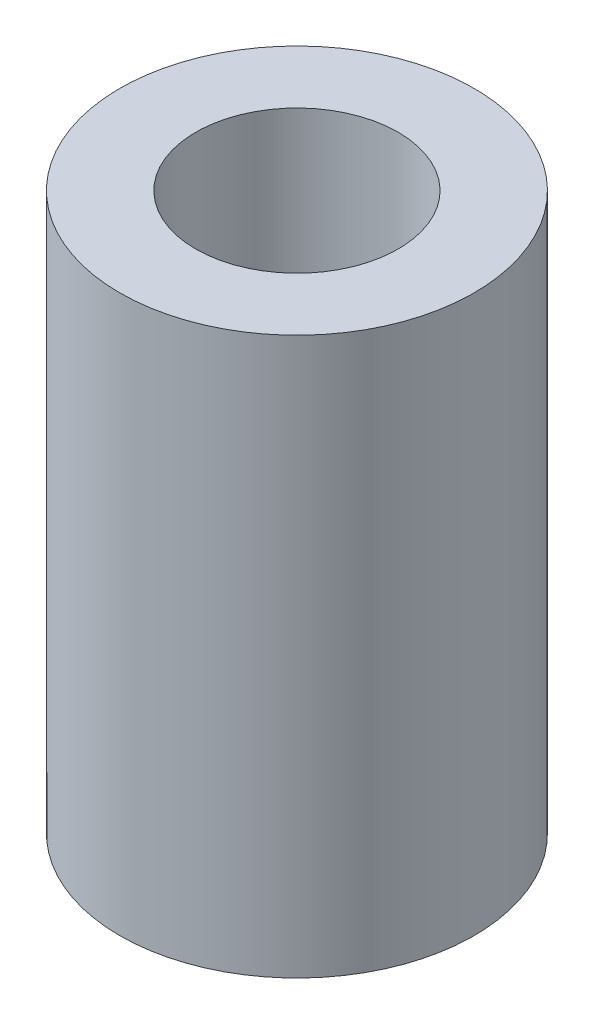
ISO-10303-21;
HEADER;
FILE_DESCRIPTION(('STEP AP214'),'2;1');
FILE_NAME('part.step','',(''),(''),'','','');
FILE_SCHEMA(('AUTOMOTIVE_DESIGN { 1 0 10303 214 1 1 1 1 }'));
ENDSEC;
DATA;
#1=APPLICATION_CONTEXT('core data for automotive mechanical design processes');
#2=APPLICATION_PROTOCOL_DEFINITION('international standard','automotive_design',2000,#1);
#3=PRODUCT_CONTEXT('',#1,'mechanical');
#4=PRODUCT('Part','Part','',(#3));
#5=PRODUCT_RELATED_PRODUCT_CATEGORY('part','',(#4));
#6=PRODUCT_DEFINITION_FORMATION('','',#4);
#7=PRODUCT_DEFINITION_CONTEXT('part definition',#1,'design');
#8=PRODUCT_DEFINITION('design','',#6,#7);
#9=PRODUCT_DEFINITION_SHAPE('','',#8);
#10=(LENGTH_UNIT() NAMED_UNIT(*) SI_UNIT(.MILLI.,.METRE.));
#11=(NAMED_UNIT(*) PLANE_ANGLE_UNIT() SI_UNIT($,.RADIAN.));
#12=(NAMED_UNIT(*) SI_UNIT($,.STERADIAN.) SOLID_ANGLE_UNIT());
#13=UNCERTAINTY_MEASURE_WITH_UNIT(LENGTH_MEASURE(1.E-05),#10,'distance_accuracy_value','');
#14=(GEOMETRIC_REPRESENTATION_CONTEXT(3) GLOBAL_UNCERTAINTY_ASSIGNED_CONTEXT((#13)) GLOBAL_UNIT_ASSIGNED_CONTEXT((#10,
#11,#12)) REPRESENTATION_CONTEXT('',''));
#15=CARTESIAN_POINT('',(0.,0.,0.));
#16=DIRECTION('',(0.,0.,1.));
#17=DIRECTION('',(1.,0.,0.));
#18=AXIS2_PLACEMENT_3D('',#15,#16,#17);
#19=CARTESIAN_POINT('',(0.,11.,0.));
#20=DIRECTION('',(0.,1.,0.));
#21=DIRECTION('',(0.,0.,1.));
#22=AXIS2_PLACEMENT_3D('',#19,#20,#21);
#23=PLANE('',#22);
#24=CARTESIAN_POINT('',(0.,11.,0.));
#25=DIRECTION('',(0.,1.,0.));
#26=DIRECTION('',(0.,0.,1.));
#27=AXIS2_PLACEMENT_3D('',#24,#25,#26);
#28=CIRCLE('',#27,3.5);
#29=CARTESIAN_POINT('',(0.,11.,3.5));
#30=VERTEX_POINT('',#29);
#31=EDGE_CURVE('E10',#30,#30,#28,.T.);
#32=ORIENTED_EDGE('',*,*,#31,.T.);
#33=EDGE_LOOP('',(#32));
#34=FACE_BOUND('',#33,.T.);
#35=CARTESIAN_POINT('',(0.,11.,0.));
#36=DIRECTION('',(0.,1.,0.));
#37=DIRECTION('',(0.,0.,1.));
#38=AXIS2_PLACEMENT_3D('',#35,#36,#37);
#39=CIRCLE('',#38,2.);
#40=CARTESIAN_POINT('',(0.,11.,2.));
#41=VERTEX_POINT('',#40);
#42=EDGE_CURVE('E50',#41,#41,#39,.T.);
#43=ORIENTED_EDGE('',*,*,#42,.F.);
#44=EDGE_LOOP('',(#43));
#45=FACE_BOUND('',#44,.T.);
#46=ADVANCED_FACE('F37',(#34,#45),#23,.T.);
#47=CARTESIAN_POINT('',(0.,0.,0.));
#48=DIRECTION('',(0.,1.,0.));
#49=DIRECTION('',(0.,0.,1.));
#50=AXIS2_PLACEMENT_3D('',#47,#48,#49);
#51=PLANE('',#50);
#52=CARTESIAN_POINT('',(0.,0.,0.));
#53=DIRECTION('',(0.,1.,0.));
#54=DIRECTION('',(0.,0.,1.));
#55=AXIS2_PLACEMENT_3D('',#52,#53,#54);
#56=CIRCLE('',#55,3.5);
#57=CARTESIAN_POINT('',(0.,0.,3.5));
#58=VERTEX_POINT('',#57);
#59=EDGE_CURVE('E41',#58,#58,#56,.T.);
#60=ORIENTED_EDGE('',*,*,#59,.F.);
#61=EDGE_LOOP('',(#60));
#62=FACE_BOUND('',#61,.T.);
#63=CARTESIAN_POINT('',(0.,0.,0.));
#64=DIRECTION('',(0.,1.,0.));
#65=DIRECTION('',(0.,0.,1.));
#66=AXIS2_PLACEMENT_3D('',#63,#64,#65);
#67=CIRCLE('',#66,2.);
#68=CARTESIAN_POINT('',(0.,0.,2.));
#69=VERTEX_POINT('',#68);
#70=EDGE_CURVE('E52',#69,#69,#67,.T.);
#71=ORIENTED_EDGE('',*,*,#70,.T.);
#72=EDGE_LOOP('',(#71));
#73=FACE_BOUND('',#72,.T.);
#74=ADVANCED_FACE('F64',(#62,#73),#51,.F.);
#75=CARTESIAN_POINT('',(0.,11.,0.));
#76=DIRECTION('',(0.,-1.,0.));
#77=DIRECTION('',(0.,0.,-1.));
#78=AXIS2_PLACEMENT_3D('',#75,#76,#77);
#79=CYLINDRICAL_SURFACE('',#78,3.5);
#80=ORIENTED_EDGE('',*,*,#31,.F.);
#81=EDGE_LOOP('',(#80));
#82=FACE_BOUND('',#81,.T.);
#83=ORIENTED_EDGE('',*,*,#59,.T.);
#84=EDGE_LOOP('',(#83));
#85=FACE_BOUND('',#84,.T.);
#86=ADVANCED_FACE('F39',(#82,#85),#79,.T.);
#87=CARTESIAN_POINT('',(0.,11.,0.));
#88=DIRECTION('',(0.,-1.,0.));
#89=DIRECTION('',(0.,0.,-1.));
#90=AXIS2_PLACEMENT_3D('',#87,#88,#89);
#91=CYLINDRICAL_SURFACE('',#90,2.);
#92=ORIENTED_EDGE('',*,*,#42,.T.);
#93=EDGE_LOOP('',(#92));
#94=FACE_BOUND('',#93,.T.);
#95=ORIENTED_EDGE('',*,*,#70,.F.);
#96=EDGE_LOOP('',(#95));
#97=FACE_BOUND('',#96,.T.);
#98=ADVANCED_FACE('F60',(#94,#97),#91,.F.);
#99=CLOSED_SHELL('',(#46,#74,#86,#98));
#100=MANIFOLD_SOLID_BREP('B2',#99);
#101=ADVANCED_BREP_SHAPE_REPRESENTATION('',(#18,#100),#14);
#102=SHAPE_DEFINITION_REPRESENTATION(#9,#101);
ENDSEC;
END-ISO-10303-21;
